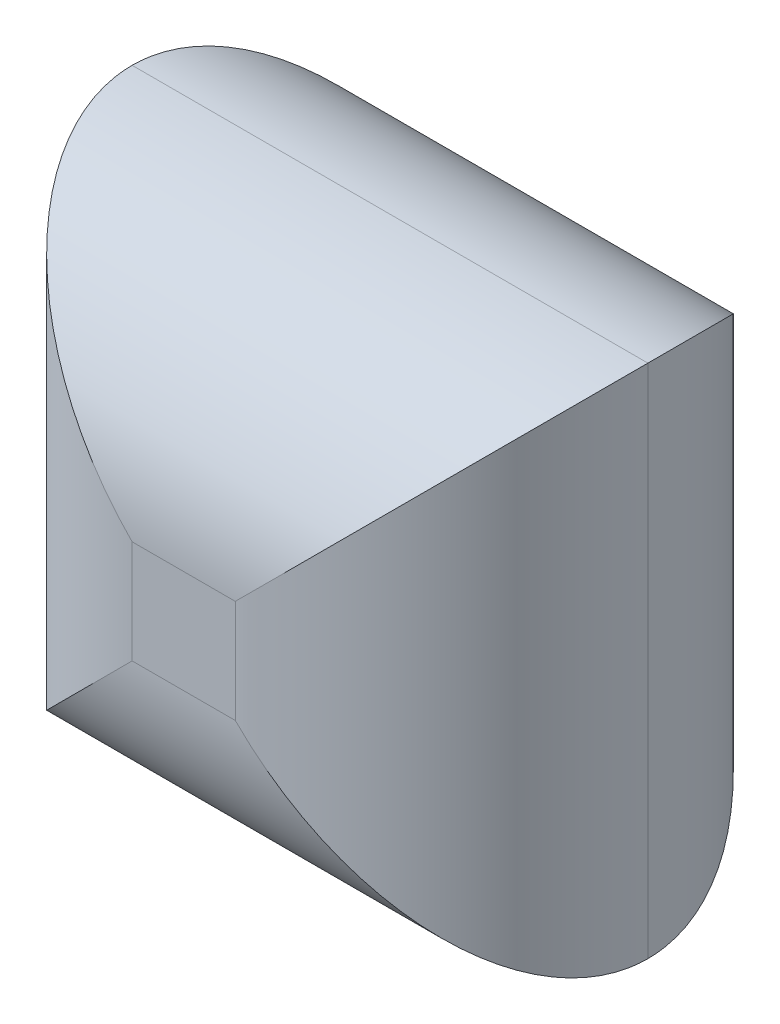
ISO-10303-21;
HEADER;
FILE_DESCRIPTION(('STEP AP214'),'2;1');
FILE_NAME('part.step','',(''),(''),'','','');
FILE_SCHEMA(('AUTOMOTIVE_DESIGN { 1 0 10303 214 1 1 1 1 }'));
ENDSEC;
DATA;
#1=APPLICATION_CONTEXT('core data for automotive mechanical design processes');
#2=APPLICATION_PROTOCOL_DEFINITION('international standard','automotive_design',2000,#1);
#3=PRODUCT_CONTEXT('',#1,'mechanical');
#4=PRODUCT('Part','Part','',(#3));
#5=PRODUCT_RELATED_PRODUCT_CATEGORY('part','',(#4));
#6=PRODUCT_DEFINITION_FORMATION('','',#4);
#7=PRODUCT_DEFINITION_CONTEXT('part definition',#1,'design');
#8=PRODUCT_DEFINITION('design','',#6,#7);
#9=PRODUCT_DEFINITION_SHAPE('','',#8);
#10=(LENGTH_UNIT() NAMED_UNIT(*) SI_UNIT(.MILLI.,.METRE.));
#11=(NAMED_UNIT(*) PLANE_ANGLE_UNIT() SI_UNIT($,.RADIAN.));
#12=(NAMED_UNIT(*) SI_UNIT($,.STERADIAN.) SOLID_ANGLE_UNIT());
#13=UNCERTAINTY_MEASURE_WITH_UNIT(LENGTH_MEASURE(1.E-05),#10,'distance_accuracy_value','');
#14=(GEOMETRIC_REPRESENTATION_CONTEXT(3) GLOBAL_UNCERTAINTY_ASSIGNED_CONTEXT((#13)) GLOBAL_UNIT_ASSIGNED_CONTEXT((#10,
#11,#12)) REPRESENTATION_CONTEXT('',''));
#15=CARTESIAN_POINT('',(0.,0.,0.));
#16=DIRECTION('',(0.,0.,1.));
#17=DIRECTION('',(1.,0.,0.));
#18=AXIS2_PLACEMENT_3D('',#15,#16,#17);
#19=CARTESIAN_POINT('',(0.,0.,100.));
#20=DIRECTION('',(0.,0.,-1.));
#21=DIRECTION('',(-1.,0.,0.));
#22=AXIS2_PLACEMENT_3D('',#19,#20,#21);
#23=PLANE('',#22);
#24=DIRECTION('',(0.,1.,0.));
#25=VECTOR('',#24,1.);
#26=CARTESIAN_POINT('',(75.,0.,100.));
#27=LINE('',#26,#25);
#28=CARTESIAN_POINT('',(75.,50.,100.));
#29=VERTEX_POINT('',#28);
#30=CARTESIAN_POINT('',(75.,75.,100.));
#31=VERTEX_POINT('',#30);
#32=EDGE_CURVE('E45',#29,#31,#27,.T.);
#33=ORIENTED_EDGE('',*,*,#32,.T.);
#34=DIRECTION('',(-1.,0.,0.));
#35=VECTOR('',#34,1.);
#36=CARTESIAN_POINT('',(0.,75.,100.));
#37=LINE('',#36,#35);
#38=CARTESIAN_POINT('',(50.,75.,100.));
#39=VERTEX_POINT('',#38);
#40=EDGE_CURVE('E11',#31,#39,#37,.T.);
#41=ORIENTED_EDGE('',*,*,#40,.T.);
#42=DIRECTION('',(0.,-1.,0.));
#43=VECTOR('',#42,1.);
#44=CARTESIAN_POINT('',(50.,0.,100.));
#45=LINE('',#44,#43);
#46=CARTESIAN_POINT('',(50.,50.,100.));
#47=VERTEX_POINT('',#46);
#48=EDGE_CURVE('E95',#39,#47,#45,.T.);
#49=ORIENTED_EDGE('',*,*,#48,.T.);
#50=DIRECTION('',(1.,0.,0.));
#51=VECTOR('',#50,1.);
#52=CARTESIAN_POINT('',(0.,50.,100.));
#53=LINE('',#52,#51);
#54=EDGE_CURVE('E98',#47,#29,#53,.T.);
#55=ORIENTED_EDGE('',*,*,#54,.T.);
#56=EDGE_LOOP('',(#33,#41,#49,#55));
#57=FACE_BOUND('',#56,.T.);
#58=ADVANCED_FACE('F35',(#57),#23,.F.);
#59=CARTESIAN_POINT('',(0.,0.,0.));
#60=DIRECTION('',(0.,0.,-1.));
#61=DIRECTION('',(-1.,0.,0.));
#62=AXIS2_PLACEMENT_3D('',#59,#60,#61);
#63=PLANE('',#62);
#64=DIRECTION('',(0.,1.,0.));
#65=VECTOR('',#64,1.);
#66=CARTESIAN_POINT('',(75.,0.,0.));
#67=LINE('',#66,#65);
#68=CARTESIAN_POINT('',(75.,75.,0.));
#69=VERTEX_POINT('',#68);
#70=CARTESIAN_POINT('',(75.,50.,0.));
#71=VERTEX_POINT('',#70);
#72=EDGE_CURVE('E142',#69,#71,#67,.F.);
#73=ORIENTED_EDGE('',*,*,#72,.T.);
#74=DIRECTION('',(1.,0.,0.));
#75=VECTOR('',#74,1.);
#76=CARTESIAN_POINT('',(0.,50.,0.));
#77=LINE('',#76,#75);
#78=CARTESIAN_POINT('',(50.,50.,0.));
#79=VERTEX_POINT('',#78);
#80=EDGE_CURVE('E99',#71,#79,#77,.F.);
#81=ORIENTED_EDGE('',*,*,#80,.T.);
#82=DIRECTION('',(0.,-1.,0.));
#83=VECTOR('',#82,1.);
#84=CARTESIAN_POINT('',(50.,125.,0.));
#85=LINE('',#84,#83);
#86=CARTESIAN_POINT('',(50.,75.,0.));
#87=VERTEX_POINT('',#86);
#88=EDGE_CURVE('E136',#79,#87,#85,.F.);
#89=ORIENTED_EDGE('',*,*,#88,.T.);
#90=DIRECTION('',(-1.,0.,0.));
#91=VECTOR('',#90,1.);
#92=CARTESIAN_POINT('',(125.,75.,0.));
#93=LINE('',#92,#91);
#94=EDGE_CURVE('E137',#87,#69,#93,.F.);
#95=ORIENTED_EDGE('',*,*,#94,.T.);
#96=EDGE_LOOP('',(#73,#81,#89,#95));
#97=FACE_BOUND('',#96,.T.);
#98=ADVANCED_FACE('F145',(#97),#63,.T.);
#99=CARTESIAN_POINT('',(0.,75.,50.));
#100=DIRECTION('',(-1.,0.,0.));
#101=DIRECTION('',(0.,0.,1.));
#102=AXIS2_PLACEMENT_3D('',#99,#100,#101);
#103=CYLINDRICAL_SURFACE('',#102,50.);
#104=CARTESIAN_POINT('',(50.,75.,50.));
#105=DIRECTION('',(-0.707106781186547,-0.707106781186547,0.));
#106=DIRECTION('',(0.707106781186547,-0.707106781186547,0.));
#107=AXIS2_PLACEMENT_3D('',#104,#105,#106);
#108=ELLIPSE('',#107,70.7106781186548,50.);
#109=CARTESIAN_POINT('',(0.,125.,50.));
#110=VERTEX_POINT('',#109);
#111=EDGE_CURVE('E39',#39,#110,#108,.T.);
#112=ORIENTED_EDGE('',*,*,#111,.F.);
#113=ORIENTED_EDGE('',*,*,#40,.F.);
#114=CARTESIAN_POINT('',(75.,75.,50.));
#115=DIRECTION('',(-0.707106781186547,0.707106781186547,0.));
#116=DIRECTION('',(0.707106781186547,0.707106781186547,0.));
#117=AXIS2_PLACEMENT_3D('',#114,#115,#116);
#118=ELLIPSE('',#117,70.7106781186548,50.);
#119=CARTESIAN_POINT('',(125.,125.,50.));
#120=VERTEX_POINT('',#119);
#121=EDGE_CURVE('E68',#120,#31,#118,.F.);
#122=ORIENTED_EDGE('',*,*,#121,.F.);
#123=DIRECTION('',(-1.,0.,0.));
#124=VECTOR('',#123,1.);
#125=CARTESIAN_POINT('',(0.,125.,50.));
#126=LINE('',#125,#124);
#127=EDGE_CURVE('E133',#110,#120,#126,.F.);
#128=ORIENTED_EDGE('',*,*,#127,.F.);
#129=EDGE_LOOP('',(#112,#113,#122,#128));
#130=FACE_BOUND('',#129,.T.);
#131=ADVANCED_FACE('F37',(#130),#103,.T.);
#132=CARTESIAN_POINT('',(50.,0.,50.));
#133=DIRECTION('',(0.,-1.,0.));
#134=DIRECTION('',(0.,0.,-1.));
#135=AXIS2_PLACEMENT_3D('',#132,#133,#134);
#136=CYLINDRICAL_SURFACE('',#135,50.);
#137=ORIENTED_EDGE('',*,*,#48,.F.);
#138=ORIENTED_EDGE('',*,*,#111,.T.);
#139=DIRECTION('',(0.,-1.,0.));
#140=VECTOR('',#139,1.);
#141=CARTESIAN_POINT('',(0.,0.,50.));
#142=LINE('',#141,#140);
#143=CARTESIAN_POINT('',(0.,0.,50.));
#144=VERTEX_POINT('',#143);
#145=EDGE_CURVE('E105',#144,#110,#142,.F.);
#146=ORIENTED_EDGE('',*,*,#145,.F.);
#147=CARTESIAN_POINT('',(50.,50.,50.));
#148=DIRECTION('',(0.707106781186547,-0.707106781186547,0.));
#149=DIRECTION('',(-0.707106781186547,-0.707106781186547,0.));
#150=AXIS2_PLACEMENT_3D('',#147,#148,#149);
#151=ELLIPSE('',#150,70.7106781186548,50.);
#152=EDGE_CURVE('E102',#47,#144,#151,.T.);
#153=ORIENTED_EDGE('',*,*,#152,.F.);
#154=EDGE_LOOP('',(#137,#138,#146,#153));
#155=FACE_BOUND('',#154,.T.);
#156=ADVANCED_FACE('F103',(#155),#136,.T.);
#157=CARTESIAN_POINT('',(75.,0.,50.));
#158=DIRECTION('',(0.,1.,0.));
#159=DIRECTION('',(0.,0.,1.));
#160=AXIS2_PLACEMENT_3D('',#157,#158,#159);
#161=CYLINDRICAL_SURFACE('',#160,50.);
#162=ORIENTED_EDGE('',*,*,#121,.T.);
#163=ORIENTED_EDGE('',*,*,#32,.F.);
#164=CARTESIAN_POINT('',(75.,50.,50.));
#165=DIRECTION('',(0.707106781186547,0.707106781186547,0.));
#166=DIRECTION('',(0.707106781186547,-0.707106781186547,0.));
#167=AXIS2_PLACEMENT_3D('',#164,#165,#166);
#168=ELLIPSE('',#167,70.7106781186548,50.);
#169=CARTESIAN_POINT('',(125.,0.,50.));
#170=VERTEX_POINT('',#169);
#171=EDGE_CURVE('E108',#170,#29,#168,.F.);
#172=ORIENTED_EDGE('',*,*,#171,.F.);
#173=DIRECTION('',(0.,1.,0.));
#174=VECTOR('',#173,1.);
#175=CARTESIAN_POINT('',(125.,0.,50.));
#176=LINE('',#175,#174);
#177=EDGE_CURVE('E125',#120,#170,#176,.F.);
#178=ORIENTED_EDGE('',*,*,#177,.F.);
#179=EDGE_LOOP('',(#162,#163,#172,#178));
#180=FACE_BOUND('',#179,.T.);
#181=ADVANCED_FACE('F152',(#180),#161,.T.);
#182=CARTESIAN_POINT('',(0.,75.,50.));
#183=DIRECTION('',(1.,0.,0.));
#184=DIRECTION('',(0.,0.,-1.));
#185=AXIS2_PLACEMENT_3D('',#182,#183,#184);
#186=CYLINDRICAL_SURFACE('',#185,50.);
#187=CARTESIAN_POINT('',(75.,75.,50.));
#188=DIRECTION('',(0.707106781186547,-0.707106781186547,0.));
#189=DIRECTION('',(0.707106781186547,0.707106781186547,0.));
#190=AXIS2_PLACEMENT_3D('',#187,#188,#189);
#191=ELLIPSE('',#190,70.7106781186548,50.);
#192=EDGE_CURVE('E122',#69,#120,#191,.T.);
#193=ORIENTED_EDGE('',*,*,#192,.F.);
#194=ORIENTED_EDGE('',*,*,#94,.F.);
#195=CARTESIAN_POINT('',(50.,75.,50.));
#196=DIRECTION('',(0.707106781186547,0.707106781186547,0.));
#197=DIRECTION('',(-0.707106781186547,0.707106781186547,0.));
#198=AXIS2_PLACEMENT_3D('',#195,#196,#197);
#199=ELLIPSE('',#198,70.7106781186548,50.);
#200=EDGE_CURVE('E130',#110,#87,#199,.F.);
#201=ORIENTED_EDGE('',*,*,#200,.F.);
#202=ORIENTED_EDGE('',*,*,#127,.T.);
#203=EDGE_LOOP('',(#193,#194,#201,#202));
#204=FACE_BOUND('',#203,.T.);
#205=ADVANCED_FACE('F154',(#204),#186,.T.);
#206=CARTESIAN_POINT('',(50.,0.,50.));
#207=DIRECTION('',(0.,1.,0.));
#208=DIRECTION('',(0.,0.,1.));
#209=AXIS2_PLACEMENT_3D('',#206,#207,#208);
#210=CYLINDRICAL_SURFACE('',#209,50.);
#211=ORIENTED_EDGE('',*,*,#200,.T.);
#212=ORIENTED_EDGE('',*,*,#88,.F.);
#213=CARTESIAN_POINT('',(50.,50.,50.));
#214=DIRECTION('',(-0.707106781186547,0.707106781186547,0.));
#215=DIRECTION('',(0.707106781186547,0.707106781186547,0.));
#216=AXIS2_PLACEMENT_3D('',#213,#214,#215);
#217=ELLIPSE('',#216,70.7106781186548,50.);
#218=EDGE_CURVE('E82',#144,#79,#217,.F.);
#219=ORIENTED_EDGE('',*,*,#218,.F.);
#220=ORIENTED_EDGE('',*,*,#145,.T.);
#221=EDGE_LOOP('',(#211,#212,#219,#220));
#222=FACE_BOUND('',#221,.T.);
#223=ADVANCED_FACE('F160',(#222),#210,.T.);
#224=CARTESIAN_POINT('',(0.,50.,50.));
#225=DIRECTION('',(1.,0.,0.));
#226=DIRECTION('',(0.,0.,-1.));
#227=AXIS2_PLACEMENT_3D('',#224,#225,#226);
#228=CYLINDRICAL_SURFACE('',#227,50.);
#229=ORIENTED_EDGE('',*,*,#54,.F.);
#230=ORIENTED_EDGE('',*,*,#152,.T.);
#231=DIRECTION('',(1.,0.,0.));
#232=VECTOR('',#231,1.);
#233=CARTESIAN_POINT('',(0.,0.,50.));
#234=LINE('',#233,#232);
#235=EDGE_CURVE('E119',#170,#144,#234,.F.);
#236=ORIENTED_EDGE('',*,*,#235,.F.);
#237=ORIENTED_EDGE('',*,*,#171,.T.);
#238=EDGE_LOOP('',(#229,#230,#236,#237));
#239=FACE_BOUND('',#238,.T.);
#240=ADVANCED_FACE('F111',(#239),#228,.T.);
#241=CARTESIAN_POINT('',(75.,0.,50.));
#242=DIRECTION('',(0.,-1.,0.));
#243=DIRECTION('',(0.,0.,-1.));
#244=AXIS2_PLACEMENT_3D('',#241,#242,#243);
#245=CYLINDRICAL_SURFACE('',#244,50.);
#246=ORIENTED_EDGE('',*,*,#192,.T.);
#247=ORIENTED_EDGE('',*,*,#177,.T.);
#248=CARTESIAN_POINT('',(75.,50.,50.));
#249=DIRECTION('',(-0.707106781186547,-0.707106781186547,0.));
#250=DIRECTION('',(0.707106781186547,-0.707106781186547,0.));
#251=AXIS2_PLACEMENT_3D('',#248,#249,#250);
#252=ELLIPSE('',#251,70.7106781186548,50.);
#253=EDGE_CURVE('E116',#71,#170,#252,.T.);
#254=ORIENTED_EDGE('',*,*,#253,.F.);
#255=ORIENTED_EDGE('',*,*,#72,.F.);
#256=EDGE_LOOP('',(#246,#247,#254,#255));
#257=FACE_BOUND('',#256,.T.);
#258=ADVANCED_FACE('F150',(#257),#245,.T.);
#259=CARTESIAN_POINT('',(0.,50.,50.));
#260=DIRECTION('',(-1.,0.,0.));
#261=DIRECTION('',(0.,0.,1.));
#262=AXIS2_PLACEMENT_3D('',#259,#260,#261);
#263=CYLINDRICAL_SURFACE('',#262,50.);
#264=ORIENTED_EDGE('',*,*,#218,.T.);
#265=ORIENTED_EDGE('',*,*,#80,.F.);
#266=ORIENTED_EDGE('',*,*,#253,.T.);
#267=ORIENTED_EDGE('',*,*,#235,.T.);
#268=EDGE_LOOP('',(#264,#265,#266,#267));
#269=FACE_BOUND('',#268,.T.);
#270=ADVANCED_FACE('F148',(#269),#263,.T.);
#271=CLOSED_SHELL('',(#58,#98,#131,#156,#181,#205,#223,#240,#258,#270));
#272=MANIFOLD_SOLID_BREP('B2',#271);
#273=ADVANCED_BREP_SHAPE_REPRESENTATION('',(#18,#272),#14);
#274=SHAPE_DEFINITION_REPRESENTATION(#9,#273);
ENDSEC;
END-ISO-10303-21;
